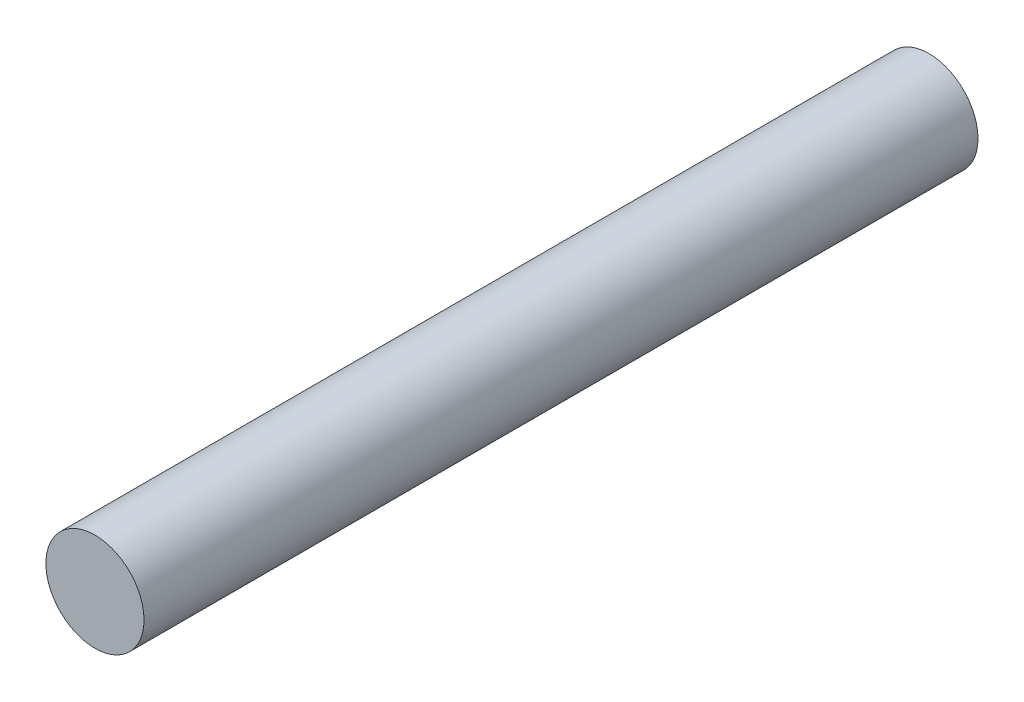
ISO-10303-21;
HEADER;
FILE_DESCRIPTION(('STEP AP214'),'2;1');
FILE_NAME('part.step','',(''),(''),'','','');
FILE_SCHEMA(('AUTOMOTIVE_DESIGN { 1 0 10303 214 1 1 1 1 }'));
ENDSEC;
DATA;
#1=APPLICATION_CONTEXT('core data for automotive mechanical design processes');
#2=APPLICATION_PROTOCOL_DEFINITION('international standard','automotive_design',2000,#1);
#3=PRODUCT_CONTEXT('',#1,'mechanical');
#4=PRODUCT('Part','Part','',(#3));
#5=PRODUCT_RELATED_PRODUCT_CATEGORY('part','',(#4));
#6=PRODUCT_DEFINITION_FORMATION('','',#4);
#7=PRODUCT_DEFINITION_CONTEXT('part definition',#1,'design');
#8=PRODUCT_DEFINITION('design','',#6,#7);
#9=PRODUCT_DEFINITION_SHAPE('','',#8);
#10=(LENGTH_UNIT() NAMED_UNIT(*) SI_UNIT(.MILLI.,.METRE.));
#11=(NAMED_UNIT(*) PLANE_ANGLE_UNIT() SI_UNIT($,.RADIAN.));
#12=(NAMED_UNIT(*) SI_UNIT($,.STERADIAN.) SOLID_ANGLE_UNIT());
#13=UNCERTAINTY_MEASURE_WITH_UNIT(LENGTH_MEASURE(1.E-05),#10,'distance_accuracy_value','');
#14=(GEOMETRIC_REPRESENTATION_CONTEXT(3) GLOBAL_UNCERTAINTY_ASSIGNED_CONTEXT((#13)) GLOBAL_UNIT_ASSIGNED_CONTEXT((#10,
#11,#12)) REPRESENTATION_CONTEXT('',''));
#15=CARTESIAN_POINT('',(0.,0.,0.));
#16=DIRECTION('',(0.,0.,1.));
#17=DIRECTION('',(1.,0.,0.));
#18=AXIS2_PLACEMENT_3D('',#15,#16,#17);
#19=CARTESIAN_POINT('',(0.,0.,215.9));
#20=DIRECTION('',(0.,0.,-1.));
#21=DIRECTION('',(-1.,0.,0.));
#22=AXIS2_PLACEMENT_3D('',#19,#20,#21);
#23=CYLINDRICAL_SURFACE('',#22,12.7);
#24=CARTESIAN_POINT('',(0.,0.,215.9));
#25=DIRECTION('',(0.,0.,1.));
#26=DIRECTION('',(1.,0.,0.));
#27=AXIS2_PLACEMENT_3D('',#24,#25,#26);
#28=CIRCLE('',#27,12.7);
#29=CARTESIAN_POINT('',(12.7,0.,215.9));
#30=VERTEX_POINT('',#29);
#31=EDGE_CURVE('E10',#30,#30,#28,.T.);
#32=ORIENTED_EDGE('',*,*,#31,.F.);
#33=EDGE_LOOP('',(#32));
#34=FACE_BOUND('',#33,.T.);
#35=CARTESIAN_POINT('',(0.,0.,0.));
#36=DIRECTION('',(0.,0.,1.));
#37=DIRECTION('',(1.,0.,0.));
#38=AXIS2_PLACEMENT_3D('',#35,#36,#37);
#39=CIRCLE('',#38,12.7);
#40=CARTESIAN_POINT('',(12.7,0.,0.));
#41=VERTEX_POINT('',#40);
#42=EDGE_CURVE('E44',#41,#41,#39,.T.);
#43=ORIENTED_EDGE('',*,*,#42,.T.);
#44=EDGE_LOOP('',(#43));
#45=FACE_BOUND('',#44,.T.);
#46=ADVANCED_FACE('F41',(#34,#45),#23,.T.);
#47=CARTESIAN_POINT('',(0.,0.,215.9));
#48=DIRECTION('',(0.,0.,1.));
#49=DIRECTION('',(1.,0.,0.));
#50=AXIS2_PLACEMENT_3D('',#47,#48,#49);
#51=PLANE('',#50);
#52=ORIENTED_EDGE('',*,*,#31,.T.);
#53=EDGE_LOOP('',(#52));
#54=FACE_BOUND('',#53,.T.);
#55=ADVANCED_FACE('F58',(#54),#51,.T.);
#56=CARTESIAN_POINT('',(0.,0.,0.));
#57=DIRECTION('',(0.,0.,1.));
#58=DIRECTION('',(1.,0.,0.));
#59=AXIS2_PLACEMENT_3D('',#56,#57,#58);
#60=PLANE('',#59);
#61=ORIENTED_EDGE('',*,*,#42,.F.);
#62=EDGE_LOOP('',(#61));
#63=FACE_BOUND('',#62,.T.);
#64=ADVANCED_FACE('F56',(#63),#60,.F.);
#65=CLOSED_SHELL('',(#46,#55,#64));
#66=MANIFOLD_SOLID_BREP('B2',#65);
#67=ADVANCED_BREP_SHAPE_REPRESENTATION('',(#18,#66),#14);
#68=SHAPE_DEFINITION_REPRESENTATION(#9,#67);
ENDSEC;
END-ISO-10303-21;
